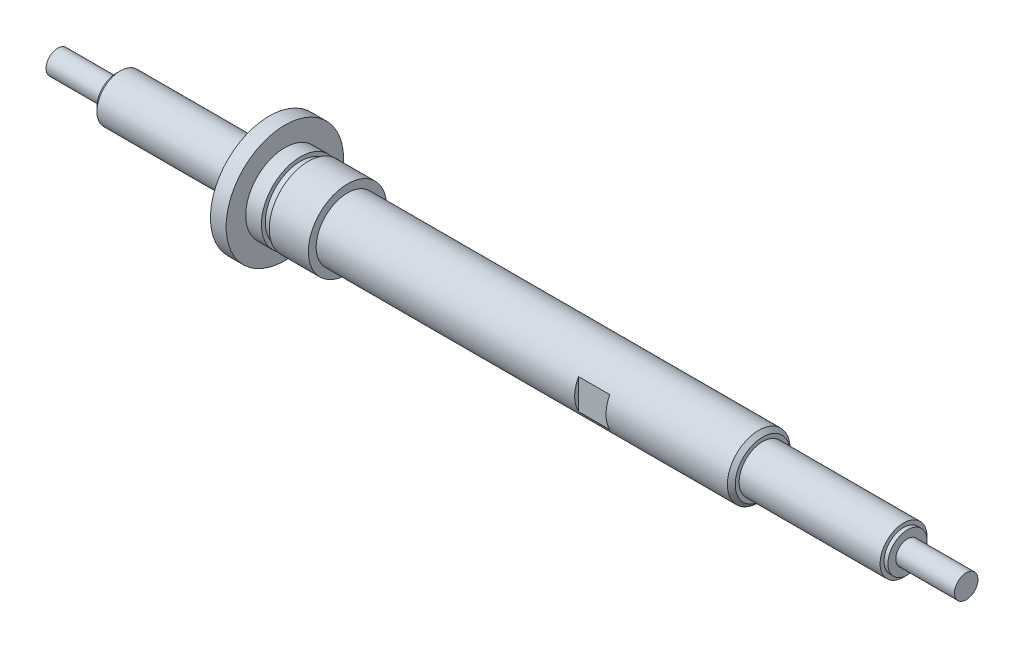
ISO-10303-21;
HEADER;
FILE_DESCRIPTION(('STEP AP214'),'2;1');
FILE_NAME('part.step','',(''),(''),'','','');
FILE_SCHEMA(('AUTOMOTIVE_DESIGN { 1 0 10303 214 1 1 1 1 }'));
ENDSEC;
DATA;
#1=APPLICATION_CONTEXT('core data for automotive mechanical design processes');
#2=APPLICATION_PROTOCOL_DEFINITION('international standard','automotive_design',2000,#1);
#3=PRODUCT_CONTEXT('',#1,'mechanical');
#4=PRODUCT('Part','Part','',(#3));
#5=PRODUCT_RELATED_PRODUCT_CATEGORY('part','',(#4));
#6=PRODUCT_DEFINITION_FORMATION('','',#4);
#7=PRODUCT_DEFINITION_CONTEXT('part definition',#1,'design');
#8=PRODUCT_DEFINITION('design','',#6,#7);
#9=PRODUCT_DEFINITION_SHAPE('','',#8);
#10=(LENGTH_UNIT() NAMED_UNIT(*) SI_UNIT(.MILLI.,.METRE.));
#11=(NAMED_UNIT(*) PLANE_ANGLE_UNIT() SI_UNIT($,.RADIAN.));
#12=(NAMED_UNIT(*) SI_UNIT($,.STERADIAN.) SOLID_ANGLE_UNIT());
#13=UNCERTAINTY_MEASURE_WITH_UNIT(LENGTH_MEASURE(1.E-05),#10,'distance_accuracy_value','');
#14=(GEOMETRIC_REPRESENTATION_CONTEXT(3) GLOBAL_UNCERTAINTY_ASSIGNED_CONTEXT((#13)) GLOBAL_UNIT_ASSIGNED_CONTEXT((#10,
#11,#12)) REPRESENTATION_CONTEXT('',''));
#15=CARTESIAN_POINT('',(0.,0.,0.));
#16=DIRECTION('',(0.,0.,1.));
#17=DIRECTION('',(1.,0.,0.));
#18=AXIS2_PLACEMENT_3D('',#15,#16,#17);
#19=CARTESIAN_POINT('',(-9.,0.,0.));
#20=DIRECTION('',(1.,0.,0.));
#21=DIRECTION('',(0.,0.,-1.));
#22=AXIS2_PLACEMENT_3D('',#19,#20,#21);
#23=CYLINDRICAL_SURFACE('',#22,3.);
#24=CARTESIAN_POINT('',(0.,0.,0.));
#25=DIRECTION('',(1.,0.,0.));
#26=DIRECTION('',(0.,0.,-1.));
#27=AXIS2_PLACEMENT_3D('',#24,#25,#26);
#28=CIRCLE('',#27,3.);
#29=CARTESIAN_POINT('',(0.,0.,-3.));
#30=VERTEX_POINT('',#29);
#31=EDGE_CURVE('E117',#30,#30,#28,.F.);
#32=ORIENTED_EDGE('',*,*,#31,.T.);
#33=EDGE_LOOP('',(#32));
#34=FACE_BOUND('',#33,.T.);
#35=CARTESIAN_POINT('',(-18.,0.,0.));
#36=DIRECTION('',(1.,0.,0.));
#37=DIRECTION('',(0.,0.,-1.));
#38=AXIS2_PLACEMENT_3D('',#35,#36,#37);
#39=CIRCLE('',#38,3.);
#40=CARTESIAN_POINT('',(-18.,0.,-3.));
#41=VERTEX_POINT('',#40);
#42=EDGE_CURVE('E176',#41,#41,#39,.T.);
#43=ORIENTED_EDGE('',*,*,#42,.T.);
#44=EDGE_LOOP('',(#43));
#45=FACE_BOUND('',#44,.T.);
#46=ADVANCED_FACE('F36',(#34,#45),#23,.T.);
#47=CARTESIAN_POINT('',(73.,0.,0.));
#48=DIRECTION('',(-1.,0.,0.));
#49=DIRECTION('',(0.,0.,1.));
#50=AXIS2_PLACEMENT_3D('',#47,#48,#49);
#51=CYLINDRICAL_SURFACE('',#50,3.);
#52=CARTESIAN_POINT('',(64.,0.,0.));
#53=DIRECTION('',(1.,0.,0.));
#54=DIRECTION('',(0.,0.,-1.));
#55=AXIS2_PLACEMENT_3D('',#52,#53,#54);
#56=CIRCLE('',#55,3.);
#57=CARTESIAN_POINT('',(64.,0.,-3.));
#58=VERTEX_POINT('',#57);
#59=EDGE_CURVE('E138',#58,#58,#56,.T.);
#60=ORIENTED_EDGE('',*,*,#59,.T.);
#61=EDGE_LOOP('',(#60));
#62=FACE_BOUND('',#61,.T.);
#63=CARTESIAN_POINT('',(82.,0.,0.));
#64=DIRECTION('',(1.,0.,0.));
#65=DIRECTION('',(0.,0.,-1.));
#66=AXIS2_PLACEMENT_3D('',#63,#64,#65);
#67=CIRCLE('',#66,3.);
#68=CARTESIAN_POINT('',(82.,0.,-3.));
#69=VERTEX_POINT('',#68);
#70=EDGE_CURVE('E161',#69,#69,#67,.T.);
#71=ORIENTED_EDGE('',*,*,#70,.F.);
#72=EDGE_LOOP('',(#71));
#73=FACE_BOUND('',#72,.T.);
#74=ADVANCED_FACE('F216',(#62,#73),#51,.T.);
#75=CARTESIAN_POINT('',(11.,0.,0.));
#76=DIRECTION('',(-1.,0.,0.));
#77=DIRECTION('',(0.,0.,1.));
#78=AXIS2_PLACEMENT_3D('',#75,#76,#77);
#79=CYLINDRICAL_SURFACE('',#78,5.);
#80=CARTESIAN_POINT('',(3.,0.,0.));
#81=DIRECTION('',(1.,0.,0.));
#82=DIRECTION('',(0.,0.,-1.));
#83=AXIS2_PLACEMENT_3D('',#80,#81,#82);
#84=CIRCLE('',#83,5.);
#85=CARTESIAN_POINT('',(3.,0.,-5.));
#86=VERTEX_POINT('',#85);
#87=EDGE_CURVE('E130',#86,#86,#84,.T.);
#88=ORIENTED_EDGE('',*,*,#87,.T.);
#89=EDGE_LOOP('',(#88));
#90=FACE_BOUND('',#89,.T.);
#91=CARTESIAN_POINT('',(5.,0.,0.));
#92=DIRECTION('',(1.,0.,0.));
#93=DIRECTION('',(0.,0.,-1.));
#94=AXIS2_PLACEMENT_3D('',#91,#92,#93);
#95=CIRCLE('',#94,5.);
#96=CARTESIAN_POINT('',(5.,0.,-5.));
#97=VERTEX_POINT('',#96);
#98=EDGE_CURVE('E142',#97,#97,#95,.T.);
#99=ORIENTED_EDGE('',*,*,#98,.F.);
#100=EDGE_LOOP('',(#99));
#101=FACE_BOUND('',#100,.T.);
#102=ADVANCED_FACE('F221',(#90,#101),#79,.T.);
#103=CARTESIAN_POINT('',(3.,0.,0.));
#104=DIRECTION('',(1.,0.,0.));
#105=DIRECTION('',(0.,0.,-1.));
#106=AXIS2_PLACEMENT_3D('',#103,#104,#105);
#107=PLANE('',#106);
#108=CARTESIAN_POINT('',(3.,0.,0.));
#109=DIRECTION('',(1.,0.,0.));
#110=DIRECTION('',(0.,0.,-1.));
#111=AXIS2_PLACEMENT_3D('',#108,#109,#110);
#112=CIRCLE('',#111,7.5);
#113=CARTESIAN_POINT('',(3.,0.,-7.5));
#114=VERTEX_POINT('',#113);
#115=EDGE_CURVE('E123',#114,#114,#112,.T.);
#116=ORIENTED_EDGE('',*,*,#115,.T.);
#117=EDGE_LOOP('',(#116));
#118=FACE_BOUND('',#117,.T.);
#119=ORIENTED_EDGE('',*,*,#87,.F.);
#120=EDGE_LOOP('',(#119));
#121=FACE_BOUND('',#120,.T.);
#122=ADVANCED_FACE('F230',(#118,#121),#107,.T.);
#123=CARTESIAN_POINT('',(0.,0.,0.));
#124=DIRECTION('',(1.,0.,0.));
#125=DIRECTION('',(0.,0.,-1.));
#126=AXIS2_PLACEMENT_3D('',#123,#124,#125);
#127=PLANE('',#126);
#128=CARTESIAN_POINT('',(0.,0.,0.));
#129=DIRECTION('',(1.,0.,0.));
#130=DIRECTION('',(0.,0.,-1.));
#131=AXIS2_PLACEMENT_3D('',#128,#129,#130);
#132=CIRCLE('',#131,3.49999999999999);
#133=CARTESIAN_POINT('',(0.,0.,-3.49999999999999));
#134=VERTEX_POINT('',#133);
#135=EDGE_CURVE('E105',#134,#134,#132,.F.);
#136=ORIENTED_EDGE('',*,*,#135,.T.);
#137=EDGE_LOOP('',(#136));
#138=FACE_BOUND('',#137,.T.);
#139=ORIENTED_EDGE('',*,*,#31,.F.);
#140=EDGE_LOOP('',(#139));
#141=FACE_BOUND('',#140,.T.);
#142=ADVANCED_FACE('F226',(#138,#141),#127,.F.);
#143=CARTESIAN_POINT('',(1.,0.,0.));
#144=DIRECTION('',(-1.,0.,0.));
#145=DIRECTION('',(0.,0.,1.));
#146=AXIS2_PLACEMENT_3D('',#143,#144,#145);
#147=CYLINDRICAL_SURFACE('',#146,4.);
#148=CARTESIAN_POINT('',(0.500000000000011,0.,0.));
#149=DIRECTION('',(1.,0.,0.));
#150=DIRECTION('',(0.,0.,-1.));
#151=AXIS2_PLACEMENT_3D('',#148,#149,#150);
#152=CIRCLE('',#151,4.);
#153=CARTESIAN_POINT('',(0.500000000000011,0.,-4.));
#154=VERTEX_POINT('',#153);
#155=EDGE_CURVE('E108',#154,#154,#152,.T.);
#156=ORIENTED_EDGE('',*,*,#155,.T.);
#157=EDGE_LOOP('',(#156));
#158=FACE_BOUND('',#157,.T.);
#159=CARTESIAN_POINT('',(1.,0.,0.));
#160=DIRECTION('',(1.,0.,0.));
#161=DIRECTION('',(0.,0.,-1.));
#162=AXIS2_PLACEMENT_3D('',#159,#160,#161);
#163=CIRCLE('',#162,4.);
#164=CARTESIAN_POINT('',(1.,0.,-4.));
#165=VERTEX_POINT('',#164);
#166=EDGE_CURVE('E120',#165,#165,#163,.T.);
#167=ORIENTED_EDGE('',*,*,#166,.F.);
#168=EDGE_LOOP('',(#167));
#169=FACE_BOUND('',#168,.T.);
#170=ADVANCED_FACE('F229',(#158,#169),#147,.T.);
#171=CARTESIAN_POINT('',(1.,0.,0.));
#172=DIRECTION('',(1.,0.,0.));
#173=DIRECTION('',(0.,0.,-1.));
#174=AXIS2_PLACEMENT_3D('',#171,#172,#173);
#175=PLANE('',#174);
#176=CARTESIAN_POINT('',(1.,0.,0.));
#177=DIRECTION('',(1.,0.,0.));
#178=DIRECTION('',(0.,0.,-1.));
#179=AXIS2_PLACEMENT_3D('',#176,#177,#178);
#180=CIRCLE('',#179,7.5);
#181=CARTESIAN_POINT('',(1.,0.,-7.5));
#182=VERTEX_POINT('',#181);
#183=EDGE_CURVE('E124',#182,#182,#180,.T.);
#184=ORIENTED_EDGE('',*,*,#183,.F.);
#185=EDGE_LOOP('',(#184));
#186=FACE_BOUND('',#185,.T.);
#187=ORIENTED_EDGE('',*,*,#166,.T.);
#188=EDGE_LOOP('',(#187));
#189=FACE_BOUND('',#188,.T.);
#190=ADVANCED_FACE('F233',(#186,#189),#175,.F.);
#191=CARTESIAN_POINT('',(3.,0.,0.));
#192=DIRECTION('',(-1.,0.,0.));
#193=DIRECTION('',(0.,0.,1.));
#194=AXIS2_PLACEMENT_3D('',#191,#192,#193);
#195=CYLINDRICAL_SURFACE('',#194,7.5);
#196=ORIENTED_EDGE('',*,*,#115,.F.);
#197=EDGE_LOOP('',(#196));
#198=FACE_BOUND('',#197,.T.);
#199=ORIENTED_EDGE('',*,*,#183,.T.);
#200=EDGE_LOOP('',(#199));
#201=FACE_BOUND('',#200,.T.);
#202=ADVANCED_FACE('F321',(#198,#201),#195,.T.);
#203=CARTESIAN_POINT('',(0.500000000000011,0.,0.));
#204=DIRECTION('',(1.,0.,0.));
#205=DIRECTION('',(0.,0.,-1.));
#206=AXIS2_PLACEMENT_3D('',#203,#204,#205);
#207=CONICAL_SURFACE('',#206,4.,0.785398163397448);
#208=ORIENTED_EDGE('',*,*,#135,.F.);
#209=EDGE_LOOP('',(#208));
#210=FACE_BOUND('',#209,.T.);
#211=ORIENTED_EDGE('',*,*,#155,.F.);
#212=EDGE_LOOP('',(#211));
#213=FACE_BOUND('',#212,.T.);
#214=ADVANCED_FACE('F38',(#210,#213),#207,.T.);
#215=CARTESIAN_POINT('',(6.,0.,0.));
#216=DIRECTION('',(1.,0.,0.));
#217=DIRECTION('',(0.,0.,-1.));
#218=AXIS2_PLACEMENT_3D('',#215,#216,#217);
#219=PLANE('',#218);
#220=CARTESIAN_POINT('',(6.,0.,0.));
#221=DIRECTION('',(1.,0.,0.));
#222=DIRECTION('',(0.,0.,-1.));
#223=AXIS2_PLACEMENT_3D('',#220,#221,#222);
#224=CIRCLE('',#223,5.);
#225=CARTESIAN_POINT('',(6.,0.,-5.));
#226=VERTEX_POINT('',#225);
#227=EDGE_CURVE('E141',#226,#226,#224,.T.);
#228=ORIENTED_EDGE('',*,*,#227,.F.);
#229=EDGE_LOOP('',(#228));
#230=FACE_BOUND('',#229,.T.);
#231=CARTESIAN_POINT('',(6.,0.,0.));
#232=DIRECTION('',(1.,0.,0.));
#233=DIRECTION('',(0.,0.,-1.));
#234=AXIS2_PLACEMENT_3D('',#231,#232,#233);
#235=CIRCLE('',#234,4.5);
#236=CARTESIAN_POINT('',(6.,0.,-4.5));
#237=VERTEX_POINT('',#236);
#238=EDGE_CURVE('E145',#237,#237,#235,.T.);
#239=ORIENTED_EDGE('',*,*,#238,.T.);
#240=EDGE_LOOP('',(#239));
#241=FACE_BOUND('',#240,.T.);
#242=ADVANCED_FACE('F301',(#230,#241),#219,.F.);
#243=CARTESIAN_POINT('',(5.,0.,0.));
#244=DIRECTION('',(1.,0.,0.));
#245=DIRECTION('',(0.,0.,-1.));
#246=AXIS2_PLACEMENT_3D('',#243,#244,#245);
#247=PLANE('',#246);
#248=ORIENTED_EDGE('',*,*,#98,.T.);
#249=EDGE_LOOP('',(#248));
#250=FACE_BOUND('',#249,.T.);
#251=CARTESIAN_POINT('',(5.,0.,0.));
#252=DIRECTION('',(1.,0.,0.));
#253=DIRECTION('',(0.,0.,-1.));
#254=AXIS2_PLACEMENT_3D('',#251,#252,#253);
#255=CIRCLE('',#254,4.5);
#256=CARTESIAN_POINT('',(5.,0.,-4.5));
#257=VERTEX_POINT('',#256);
#258=EDGE_CURVE('E148',#257,#257,#255,.T.);
#259=ORIENTED_EDGE('',*,*,#258,.F.);
#260=EDGE_LOOP('',(#259));
#261=FACE_BOUND('',#260,.T.);
#262=ADVANCED_FACE('F299',(#250,#261),#247,.T.);
#263=CARTESIAN_POINT('',(6.,0.,0.));
#264=DIRECTION('',(-1.,0.,0.));
#265=DIRECTION('',(0.,0.,1.));
#266=AXIS2_PLACEMENT_3D('',#263,#264,#265);
#267=CYLINDRICAL_SURFACE('',#266,4.5);
#268=ORIENTED_EDGE('',*,*,#238,.F.);
#269=EDGE_LOOP('',(#268));
#270=FACE_BOUND('',#269,.T.);
#271=ORIENTED_EDGE('',*,*,#258,.T.);
#272=EDGE_LOOP('',(#271));
#273=FACE_BOUND('',#272,.T.);
#274=ADVANCED_FACE('F245',(#270,#273),#267,.T.);
#275=CARTESIAN_POINT('',(64.,0.,0.));
#276=DIRECTION('',(1.,0.,0.));
#277=DIRECTION('',(0.,0.,-1.));
#278=AXIS2_PLACEMENT_3D('',#275,#276,#277);
#279=PLANE('',#278);
#280=CARTESIAN_POINT('',(64.,0.,0.));
#281=DIRECTION('',(1.,0.,0.));
#282=DIRECTION('',(0.,0.,-1.));
#283=AXIS2_PLACEMENT_3D('',#280,#281,#282);
#284=CIRCLE('',#283,3.50000000000002);
#285=CARTESIAN_POINT('',(64.,0.,-3.50000000000002));
#286=VERTEX_POINT('',#285);
#287=EDGE_CURVE('E114',#286,#286,#284,.T.);
#288=ORIENTED_EDGE('',*,*,#287,.T.);
#289=EDGE_LOOP('',(#288));
#290=FACE_BOUND('',#289,.T.);
#291=ORIENTED_EDGE('',*,*,#59,.F.);
#292=EDGE_LOOP('',(#291));
#293=FACE_BOUND('',#292,.T.);
#294=ADVANCED_FACE('F237',(#290,#293),#279,.T.);
#295=CARTESIAN_POINT('',(64.,0.,0.));
#296=DIRECTION('',(-1.,0.,0.));
#297=DIRECTION('',(0.,0.,1.));
#298=AXIS2_PLACEMENT_3D('',#295,#296,#297);
#299=CONICAL_SURFACE('',#298,3.50000000000002,0.785398163397445);
#300=CARTESIAN_POINT('',(63.5,0.,0.));
#301=DIRECTION('',(1.,0.,0.));
#302=DIRECTION('',(0.,0.,-1.));
#303=AXIS2_PLACEMENT_3D('',#300,#301,#302);
#304=CIRCLE('',#303,4.);
#305=CARTESIAN_POINT('',(63.5,0.,-4.));
#306=VERTEX_POINT('',#305);
#307=EDGE_CURVE('E111',#306,#306,#304,.F.);
#308=ORIENTED_EDGE('',*,*,#307,.F.);
#309=EDGE_LOOP('',(#308));
#310=FACE_BOUND('',#309,.T.);
#311=ORIENTED_EDGE('',*,*,#287,.F.);
#312=EDGE_LOOP('',(#311));
#313=FACE_BOUND('',#312,.T.);
#314=ADVANCED_FACE('F235',(#310,#313),#299,.T.);
#315=CARTESIAN_POINT('',(64.,0.,0.));
#316=DIRECTION('',(-1.,0.,0.));
#317=DIRECTION('',(0.,0.,1.));
#318=AXIS2_PLACEMENT_3D('',#315,#316,#317);
#319=CYLINDRICAL_SURFACE('',#318,4.);
#320=CARTESIAN_POINT('',(44.,0.,0.));
#321=DIRECTION('',(-1.,0.,0.));
#322=DIRECTION('',(0.,0.,1.));
#323=AXIS2_PLACEMENT_3D('',#320,#321,#322);
#324=CIRCLE('',#323,4.);
#325=CARTESIAN_POINT('',(44.,-1.93649167310371,3.5));
#326=VERTEX_POINT('',#325);
#327=CARTESIAN_POINT('',(44.,1.93649167310371,3.5));
#328=VERTEX_POINT('',#327);
#329=EDGE_CURVE('E11',#326,#328,#324,.T.);
#330=ORIENTED_EDGE('',*,*,#329,.T.);
#331=DIRECTION('',(-1.,0.,0.));
#332=VECTOR('',#331,1.);
#333=CARTESIAN_POINT('',(64.,1.93649167310371,3.5));
#334=LINE('',#333,#332);
#335=CARTESIAN_POINT('',(48.,1.9364916731037,3.5));
#336=VERTEX_POINT('',#335);
#337=EDGE_CURVE('E80',#328,#336,#334,.F.);
#338=ORIENTED_EDGE('',*,*,#337,.T.);
#339=CARTESIAN_POINT('',(48.,0.,0.));
#340=DIRECTION('',(1.,0.,0.));
#341=DIRECTION('',(0.,0.,-1.));
#342=AXIS2_PLACEMENT_3D('',#339,#340,#341);
#343=CIRCLE('',#342,4.);
#344=CARTESIAN_POINT('',(48.,-1.9364916731037,3.5));
#345=VERTEX_POINT('',#344);
#346=EDGE_CURVE('E75',#336,#345,#343,.T.);
#347=ORIENTED_EDGE('',*,*,#346,.T.);
#348=DIRECTION('',(-1.,0.,0.));
#349=VECTOR('',#348,1.);
#350=CARTESIAN_POINT('',(64.,-1.93649167310371,3.5));
#351=LINE('',#350,#349);
#352=EDGE_CURVE('E44',#345,#326,#351,.T.);
#353=ORIENTED_EDGE('',*,*,#352,.T.);
#354=EDGE_LOOP('',(#330,#338,#347,#353));
#355=FACE_BOUND('',#354,.T.);
#356=CARTESIAN_POINT('',(48.,0.,0.));
#357=DIRECTION('',(1.,0.,0.));
#358=DIRECTION('',(0.,0.,-1.));
#359=AXIS2_PLACEMENT_3D('',#356,#357,#358);
#360=CIRCLE('',#359,4.);
#361=CARTESIAN_POINT('',(48.,-1.93649167310371,-3.5));
#362=VERTEX_POINT('',#361);
#363=CARTESIAN_POINT('',(48.,1.93649167310371,-3.5));
#364=VERTEX_POINT('',#363);
#365=EDGE_CURVE('E100',#362,#364,#360,.T.);
#366=ORIENTED_EDGE('',*,*,#365,.T.);
#367=DIRECTION('',(-1.,0.,0.));
#368=VECTOR('',#367,1.);
#369=CARTESIAN_POINT('',(64.,1.93649167310371,-3.5));
#370=LINE('',#369,#368);
#371=CARTESIAN_POINT('',(44.,1.93649167310371,-3.5));
#372=VERTEX_POINT('',#371);
#373=EDGE_CURVE('E81',#364,#372,#370,.T.);
#374=ORIENTED_EDGE('',*,*,#373,.T.);
#375=CARTESIAN_POINT('',(44.,0.,0.));
#376=DIRECTION('',(-1.,0.,0.));
#377=DIRECTION('',(0.,0.,1.));
#378=AXIS2_PLACEMENT_3D('',#375,#376,#377);
#379=CIRCLE('',#378,4.);
#380=CARTESIAN_POINT('',(44.,-1.93649167310371,-3.5));
#381=VERTEX_POINT('',#380);
#382=EDGE_CURVE('E97',#372,#381,#379,.T.);
#383=ORIENTED_EDGE('',*,*,#382,.T.);
#384=DIRECTION('',(-1.,0.,0.));
#385=VECTOR('',#384,1.);
#386=CARTESIAN_POINT('',(64.,-1.93649167310371,-3.5));
#387=LINE('',#386,#385);
#388=EDGE_CURVE('E102',#381,#362,#387,.F.);
#389=ORIENTED_EDGE('',*,*,#388,.T.);
#390=EDGE_LOOP('',(#366,#374,#383,#389));
#391=FACE_BOUND('',#390,.T.);
#392=ORIENTED_EDGE('',*,*,#307,.T.);
#393=EDGE_LOOP('',(#392));
#394=FACE_BOUND('',#393,.T.);
#395=CARTESIAN_POINT('',(11.,0.,0.));
#396=DIRECTION('',(1.,0.,0.));
#397=DIRECTION('',(0.,0.,-1.));
#398=AXIS2_PLACEMENT_3D('',#395,#396,#397);
#399=CIRCLE('',#398,4.);
#400=CARTESIAN_POINT('',(11.,0.,-4.));
#401=VERTEX_POINT('',#400);
#402=EDGE_CURVE('E133',#401,#401,#399,.T.);
#403=ORIENTED_EDGE('',*,*,#402,.T.);
#404=EDGE_LOOP('',(#403));
#405=FACE_BOUND('',#404,.T.);
#406=ADVANCED_FACE('F91',(#355,#391,#394,#405),#319,.T.);
#407=CARTESIAN_POINT('',(11.,0.,0.));
#408=DIRECTION('',(1.,0.,0.));
#409=DIRECTION('',(0.,0.,-1.));
#410=AXIS2_PLACEMENT_3D('',#407,#408,#409);
#411=PLANE('',#410);
#412=CARTESIAN_POINT('',(11.,0.,0.));
#413=DIRECTION('',(1.,0.,0.));
#414=DIRECTION('',(0.,0.,-1.));
#415=AXIS2_PLACEMENT_3D('',#412,#413,#414);
#416=CIRCLE('',#415,5.);
#417=CARTESIAN_POINT('',(11.,0.,-5.));
#418=VERTEX_POINT('',#417);
#419=EDGE_CURVE('E127',#418,#418,#416,.T.);
#420=ORIENTED_EDGE('',*,*,#419,.T.);
#421=EDGE_LOOP('',(#420));
#422=FACE_BOUND('',#421,.T.);
#423=ORIENTED_EDGE('',*,*,#402,.F.);
#424=EDGE_LOOP('',(#423));
#425=FACE_BOUND('',#424,.T.);
#426=ADVANCED_FACE('F243',(#422,#425),#411,.T.);
#427=ORIENTED_EDGE('',*,*,#227,.T.);
#428=EDGE_LOOP('',(#427));
#429=FACE_BOUND('',#428,.T.);
#430=ORIENTED_EDGE('',*,*,#419,.F.);
#431=EDGE_LOOP('',(#430));
#432=FACE_BOUND('',#431,.T.);
#433=ADVANCED_FACE('F295',(#429,#432),#79,.T.);
#434=CARTESIAN_POINT('',(44.,-5.,-4.));
#435=DIRECTION('',(-1.,0.,0.));
#436=DIRECTION('',(0.,0.,1.));
#437=AXIS2_PLACEMENT_3D('',#434,#435,#436);
#438=PLANE('',#437);
#439=DIRECTION('',(0.,1.,0.));
#440=VECTOR('',#439,1.);
#441=CARTESIAN_POINT('',(44.,-5.,-3.5));
#442=LINE('',#441,#440);
#443=EDGE_CURVE('E153',#381,#372,#442,.T.);
#444=ORIENTED_EDGE('',*,*,#443,.F.);
#445=ORIENTED_EDGE('',*,*,#382,.F.);
#446=EDGE_LOOP('',(#444,#445));
#447=FACE_BOUND('',#446,.T.);
#448=ADVANCED_FACE('F289',(#447),#438,.F.);
#449=CARTESIAN_POINT('',(48.,-5.,-4.));
#450=DIRECTION('',(1.,0.,0.));
#451=DIRECTION('',(0.,0.,-1.));
#452=AXIS2_PLACEMENT_3D('',#449,#450,#451);
#453=PLANE('',#452);
#454=ORIENTED_EDGE('',*,*,#365,.F.);
#455=DIRECTION('',(0.,1.,0.));
#456=VECTOR('',#455,1.);
#457=CARTESIAN_POINT('',(48.,-5.,-3.5));
#458=LINE('',#457,#456);
#459=EDGE_CURVE('E58',#362,#364,#458,.T.);
#460=ORIENTED_EDGE('',*,*,#459,.T.);
#461=EDGE_LOOP('',(#454,#460));
#462=FACE_BOUND('',#461,.T.);
#463=ADVANCED_FACE('F286',(#462),#453,.F.);
#464=CARTESIAN_POINT('',(44.,-5.,-3.5));
#465=DIRECTION('',(0.,0.,1.));
#466=DIRECTION('',(1.,0.,0.));
#467=AXIS2_PLACEMENT_3D('',#464,#465,#466);
#468=PLANE('',#467);
#469=ORIENTED_EDGE('',*,*,#459,.F.);
#470=ORIENTED_EDGE('',*,*,#388,.F.);
#471=ORIENTED_EDGE('',*,*,#443,.T.);
#472=ORIENTED_EDGE('',*,*,#373,.F.);
#473=EDGE_LOOP('',(#469,#470,#471,#472));
#474=FACE_BOUND('',#473,.T.);
#475=ADVANCED_FACE('F282',(#474),#468,.F.);
#476=CARTESIAN_POINT('',(44.,-5.,4.00000000000001));
#477=DIRECTION('',(-1.,0.,0.));
#478=DIRECTION('',(0.,0.,1.));
#479=AXIS2_PLACEMENT_3D('',#476,#477,#478);
#480=PLANE('',#479);
#481=ORIENTED_EDGE('',*,*,#329,.F.);
#482=DIRECTION('',(0.,1.,0.));
#483=VECTOR('',#482,1.);
#484=CARTESIAN_POINT('',(44.,-5.,3.5));
#485=LINE('',#484,#483);
#486=EDGE_CURVE('E88',#326,#328,#485,.T.);
#487=ORIENTED_EDGE('',*,*,#486,.T.);
#488=EDGE_LOOP('',(#481,#487));
#489=FACE_BOUND('',#488,.T.);
#490=ADVANCED_FACE('F279',(#489),#480,.F.);
#491=CARTESIAN_POINT('',(44.,-5.,3.5));
#492=DIRECTION('',(0.,0.,-1.));
#493=DIRECTION('',(-1.,0.,0.));
#494=AXIS2_PLACEMENT_3D('',#491,#492,#493);
#495=PLANE('',#494);
#496=DIRECTION('',(0.,1.,0.));
#497=VECTOR('',#496,1.);
#498=CARTESIAN_POINT('',(48.,-5.,3.5));
#499=LINE('',#498,#497);
#500=EDGE_CURVE('E50',#345,#336,#499,.T.);
#501=ORIENTED_EDGE('',*,*,#500,.T.);
#502=ORIENTED_EDGE('',*,*,#337,.F.);
#503=ORIENTED_EDGE('',*,*,#486,.F.);
#504=ORIENTED_EDGE('',*,*,#352,.F.);
#505=EDGE_LOOP('',(#501,#502,#503,#504));
#506=FACE_BOUND('',#505,.T.);
#507=ADVANCED_FACE('F85',(#506),#495,.F.);
#508=CARTESIAN_POINT('',(48.,-5.,4.));
#509=DIRECTION('',(1.,0.,0.));
#510=DIRECTION('',(0.,0.,-1.));
#511=AXIS2_PLACEMENT_3D('',#508,#509,#510);
#512=PLANE('',#511);
#513=ORIENTED_EDGE('',*,*,#500,.F.);
#514=ORIENTED_EDGE('',*,*,#346,.F.);
#515=EDGE_LOOP('',(#513,#514));
#516=FACE_BOUND('',#515,.T.);
#517=ADVANCED_FACE('F76',(#516),#512,.F.);
#518=CARTESIAN_POINT('',(82.,0.,0.));
#519=DIRECTION('',(1.,0.,0.));
#520=DIRECTION('',(0.,0.,-1.));
#521=AXIS2_PLACEMENT_3D('',#518,#519,#520);
#522=PLANE('',#521);
#523=CARTESIAN_POINT('',(82.,0.,0.));
#524=DIRECTION('',(1.,0.,0.));
#525=DIRECTION('',(0.,0.,-1.));
#526=AXIS2_PLACEMENT_3D('',#523,#524,#525);
#527=CIRCLE('',#526,2.5);
#528=CARTESIAN_POINT('',(82.,0.,-2.5));
#529=VERTEX_POINT('',#528);
#530=EDGE_CURVE('E166',#529,#529,#527,.T.);
#531=ORIENTED_EDGE('',*,*,#530,.F.);
#532=EDGE_LOOP('',(#531));
#533=FACE_BOUND('',#532,.T.);
#534=ORIENTED_EDGE('',*,*,#70,.T.);
#535=EDGE_LOOP('',(#534));
#536=FACE_BOUND('',#535,.T.);
#537=ADVANCED_FACE('F256',(#533,#536),#522,.T.);
#538=CARTESIAN_POINT('',(82.,0.,0.));
#539=DIRECTION('',(1.,0.,0.));
#540=DIRECTION('',(0.,0.,-1.));
#541=AXIS2_PLACEMENT_3D('',#538,#539,#540);
#542=CYLINDRICAL_SURFACE('',#541,2.5);
#543=ORIENTED_EDGE('',*,*,#530,.T.);
#544=EDGE_LOOP('',(#543));
#545=FACE_BOUND('',#544,.T.);
#546=CARTESIAN_POINT('',(82.5,0.,0.));
#547=DIRECTION('',(1.,0.,0.));
#548=DIRECTION('',(0.,0.,-1.));
#549=AXIS2_PLACEMENT_3D('',#546,#547,#548);
#550=CIRCLE('',#549,2.5);
#551=CARTESIAN_POINT('',(82.5,0.,-2.5));
#552=VERTEX_POINT('',#551);
#553=EDGE_CURVE('E167',#552,#552,#550,.T.);
#554=ORIENTED_EDGE('',*,*,#553,.F.);
#555=EDGE_LOOP('',(#554));
#556=FACE_BOUND('',#555,.T.);
#557=ADVANCED_FACE('F258',(#545,#556),#542,.T.);
#558=CARTESIAN_POINT('',(90.,0.,0.));
#559=DIRECTION('',(1.,0.,0.));
#560=DIRECTION('',(0.,0.,-1.));
#561=AXIS2_PLACEMENT_3D('',#558,#559,#560);
#562=PLANE('',#561);
#563=CARTESIAN_POINT('',(90.,0.,0.));
#564=DIRECTION('',(1.,0.,0.));
#565=DIRECTION('',(0.,0.,-1.));
#566=AXIS2_PLACEMENT_3D('',#563,#564,#565);
#567=CIRCLE('',#566,1.5);
#568=CARTESIAN_POINT('',(90.,0.,-1.5));
#569=VERTEX_POINT('',#568);
#570=EDGE_CURVE('E158',#569,#569,#567,.T.);
#571=ORIENTED_EDGE('',*,*,#570,.T.);
#572=EDGE_LOOP('',(#571));
#573=FACE_BOUND('',#572,.T.);
#574=ADVANCED_FACE('F265',(#573),#562,.T.);
#575=CARTESIAN_POINT('',(82.5,0.,0.));
#576=DIRECTION('',(1.,0.,0.));
#577=DIRECTION('',(0.,0.,-1.));
#578=AXIS2_PLACEMENT_3D('',#575,#576,#577);
#579=CYLINDRICAL_SURFACE('',#578,1.5);
#580=CARTESIAN_POINT('',(82.5,0.,0.));
#581=DIRECTION('',(1.,0.,0.));
#582=DIRECTION('',(0.,0.,-1.));
#583=AXIS2_PLACEMENT_3D('',#580,#581,#582);
#584=CIRCLE('',#583,1.5);
#585=CARTESIAN_POINT('',(82.5,0.,-1.5));
#586=VERTEX_POINT('',#585);
#587=EDGE_CURVE('E89',#586,#586,#584,.T.);
#588=ORIENTED_EDGE('',*,*,#587,.T.);
#589=EDGE_LOOP('',(#588));
#590=FACE_BOUND('',#589,.T.);
#591=ORIENTED_EDGE('',*,*,#570,.F.);
#592=EDGE_LOOP('',(#591));
#593=FACE_BOUND('',#592,.T.);
#594=ADVANCED_FACE('F271',(#590,#593),#579,.T.);
#595=CARTESIAN_POINT('',(82.5,0.,0.));
#596=DIRECTION('',(1.,0.,0.));
#597=DIRECTION('',(0.,0.,-1.));
#598=AXIS2_PLACEMENT_3D('',#595,#596,#597);
#599=PLANE('',#598);
#600=ORIENTED_EDGE('',*,*,#587,.F.);
#601=EDGE_LOOP('',(#600));
#602=FACE_BOUND('',#601,.T.);
#603=ORIENTED_EDGE('',*,*,#553,.T.);
#604=EDGE_LOOP('',(#603));
#605=FACE_BOUND('',#604,.T.);
#606=ADVANCED_FACE('F274',(#602,#605),#599,.T.);
#607=CARTESIAN_POINT('',(-18.,0.,0.));
#608=DIRECTION('',(-1.,0.,0.));
#609=DIRECTION('',(0.,0.,-1.));
#610=AXIS2_PLACEMENT_3D('',#607,#608,#609);
#611=PLANE('',#610);
#612=ORIENTED_EDGE('',*,*,#42,.F.);
#613=EDGE_LOOP('',(#612));
#614=FACE_BOUND('',#613,.T.);
#615=CARTESIAN_POINT('',(-18.,0.,0.));
#616=DIRECTION('',(1.,0.,0.));
#617=DIRECTION('',(0.,0.,-1.));
#618=AXIS2_PLACEMENT_3D('',#615,#616,#617);
#619=CIRCLE('',#618,2.5);
#620=CARTESIAN_POINT('',(-18.,0.,-2.5));
#621=VERTEX_POINT('',#620);
#622=EDGE_CURVE('E181',#621,#621,#619,.T.);
#623=ORIENTED_EDGE('',*,*,#622,.T.);
#624=EDGE_LOOP('',(#623));
#625=FACE_BOUND('',#624,.T.);
#626=ADVANCED_FACE('F188',(#614,#625),#611,.T.);
#627=CARTESIAN_POINT('',(-18.,0.,0.));
#628=DIRECTION('',(-1.,0.,0.));
#629=DIRECTION('',(0.,0.,1.));
#630=AXIS2_PLACEMENT_3D('',#627,#628,#629);
#631=CYLINDRICAL_SURFACE('',#630,2.5);
#632=ORIENTED_EDGE('',*,*,#622,.F.);
#633=EDGE_LOOP('',(#632));
#634=FACE_BOUND('',#633,.T.);
#635=CARTESIAN_POINT('',(-18.5,0.,0.));
#636=DIRECTION('',(1.,0.,0.));
#637=DIRECTION('',(0.,0.,-1.));
#638=AXIS2_PLACEMENT_3D('',#635,#636,#637);
#639=CIRCLE('',#638,2.5);
#640=CARTESIAN_POINT('',(-18.5,0.,-2.5));
#641=VERTEX_POINT('',#640);
#642=EDGE_CURVE('E182',#641,#641,#639,.T.);
#643=ORIENTED_EDGE('',*,*,#642,.T.);
#644=EDGE_LOOP('',(#643));
#645=FACE_BOUND('',#644,.T.);
#646=ADVANCED_FACE('F190',(#634,#645),#631,.T.);
#647=CARTESIAN_POINT('',(-26.,0.,0.));
#648=DIRECTION('',(-1.,0.,0.));
#649=DIRECTION('',(0.,0.,1.));
#650=AXIS2_PLACEMENT_3D('',#647,#648,#649);
#651=PLANE('',#650);
#652=CARTESIAN_POINT('',(-26.,0.,0.));
#653=DIRECTION('',(1.,0.,0.));
#654=DIRECTION('',(0.,0.,-1.));
#655=AXIS2_PLACEMENT_3D('',#652,#653,#654);
#656=CIRCLE('',#655,1.5);
#657=CARTESIAN_POINT('',(-26.,0.,-1.5));
#658=VERTEX_POINT('',#657);
#659=EDGE_CURVE('E173',#658,#658,#656,.T.);
#660=ORIENTED_EDGE('',*,*,#659,.F.);
#661=EDGE_LOOP('',(#660));
#662=FACE_BOUND('',#661,.T.);
#663=ADVANCED_FACE('F193',(#662),#651,.T.);
#664=CARTESIAN_POINT('',(-18.5,0.,0.));
#665=DIRECTION('',(-1.,0.,0.));
#666=DIRECTION('',(0.,0.,1.));
#667=AXIS2_PLACEMENT_3D('',#664,#665,#666);
#668=CYLINDRICAL_SURFACE('',#667,1.5);
#669=CARTESIAN_POINT('',(-18.5,0.,0.));
#670=DIRECTION('',(1.,0.,0.));
#671=DIRECTION('',(0.,0.,-1.));
#672=AXIS2_PLACEMENT_3D('',#669,#670,#671);
#673=CIRCLE('',#672,1.5);
#674=CARTESIAN_POINT('',(-18.5,0.,-1.5));
#675=VERTEX_POINT('',#674);
#676=EDGE_CURVE('E170',#675,#675,#673,.T.);
#677=ORIENTED_EDGE('',*,*,#676,.F.);
#678=EDGE_LOOP('',(#677));
#679=FACE_BOUND('',#678,.T.);
#680=ORIENTED_EDGE('',*,*,#659,.T.);
#681=EDGE_LOOP('',(#680));
#682=FACE_BOUND('',#681,.T.);
#683=ADVANCED_FACE('F200',(#679,#682),#668,.T.);
#684=CARTESIAN_POINT('',(-18.5,0.,0.));
#685=DIRECTION('',(-1.,0.,0.));
#686=DIRECTION('',(0.,0.,-1.));
#687=AXIS2_PLACEMENT_3D('',#684,#685,#686);
#688=PLANE('',#687);
#689=ORIENTED_EDGE('',*,*,#642,.F.);
#690=EDGE_LOOP('',(#689));
#691=FACE_BOUND('',#690,.T.);
#692=ORIENTED_EDGE('',*,*,#676,.T.);
#693=EDGE_LOOP('',(#692));
#694=FACE_BOUND('',#693,.T.);
#695=ADVANCED_FACE('F197',(#691,#694),#688,.T.);
#696=CLOSED_SHELL('',(#46,#74,#102,#122,#142,#170,#190,#202,#214,#242,#262,#274,#294,#314,#406,
#426,#433,#448,#463,#475,#490,#507,#517,#537,#557,#574,#594,#606,#626,#646,#663,#683,#695));
#697=MANIFOLD_SOLID_BREP('B2',#696);
#698=ADVANCED_BREP_SHAPE_REPRESENTATION('',(#18,#697),#14);
#699=SHAPE_DEFINITION_REPRESENTATION(#9,#698);
ENDSEC;
END-ISO-10303-21;
